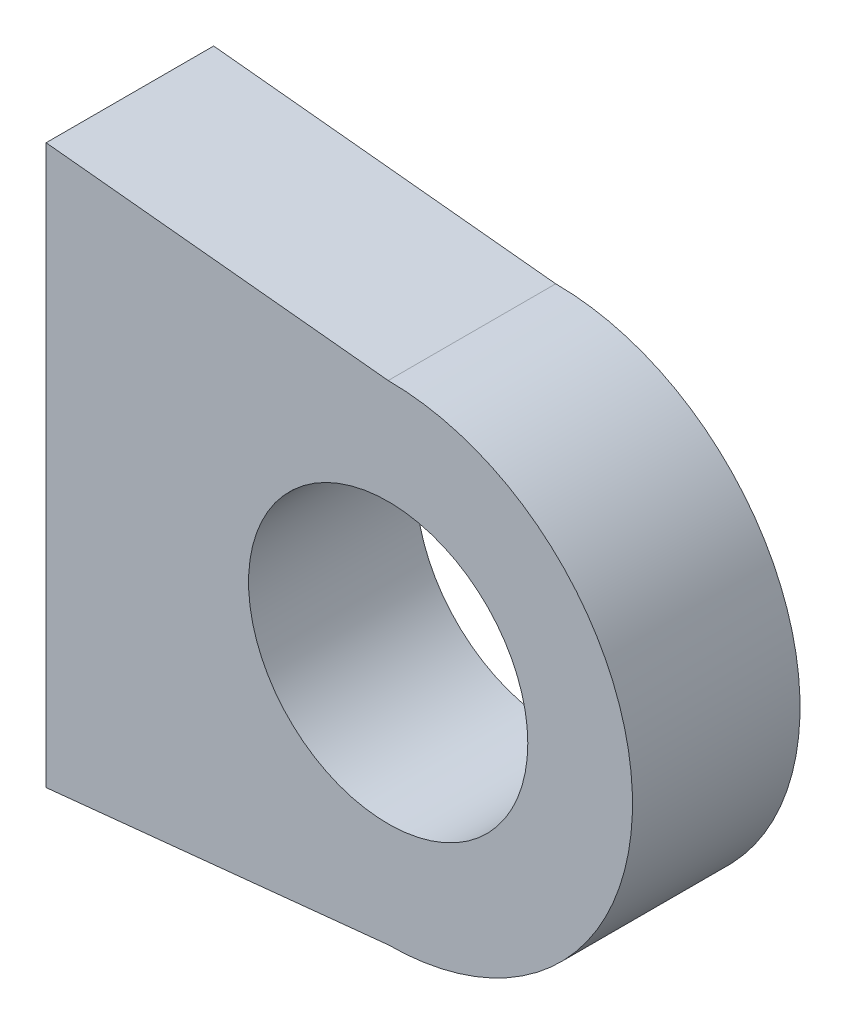
ISO-10303-21;
HEADER;
FILE_DESCRIPTION(('STEP AP214'),'2;1');
FILE_NAME('part.step','',(''),(''),'','','');
FILE_SCHEMA(('AUTOMOTIVE_DESIGN { 1 0 10303 214 1 1 1 1 }'));
ENDSEC;
DATA;
#1=APPLICATION_CONTEXT('core data for automotive mechanical design processes');
#2=APPLICATION_PROTOCOL_DEFINITION('international standard','automotive_design',2000,#1);
#3=PRODUCT_CONTEXT('',#1,'mechanical');
#4=PRODUCT('Part','Part','',(#3));
#5=PRODUCT_RELATED_PRODUCT_CATEGORY('part','',(#4));
#6=PRODUCT_DEFINITION_FORMATION('','',#4);
#7=PRODUCT_DEFINITION_CONTEXT('part definition',#1,'design');
#8=PRODUCT_DEFINITION('design','',#6,#7);
#9=PRODUCT_DEFINITION_SHAPE('','',#8);
#10=(LENGTH_UNIT() NAMED_UNIT(*) SI_UNIT(.MILLI.,.METRE.));
#11=(NAMED_UNIT(*) PLANE_ANGLE_UNIT() SI_UNIT($,.RADIAN.));
#12=(NAMED_UNIT(*) SI_UNIT($,.STERADIAN.) SOLID_ANGLE_UNIT());
#13=UNCERTAINTY_MEASURE_WITH_UNIT(LENGTH_MEASURE(1.E-05),#10,'distance_accuracy_value','');
#14=(GEOMETRIC_REPRESENTATION_CONTEXT(3) GLOBAL_UNCERTAINTY_ASSIGNED_CONTEXT((#13)) GLOBAL_UNIT_ASSIGNED_CONTEXT((#10,
#11,#12)) REPRESENTATION_CONTEXT('',''));
#15=CARTESIAN_POINT('',(0.,0.,0.));
#16=DIRECTION('',(0.,0.,1.));
#17=DIRECTION('',(1.,0.,0.));
#18=AXIS2_PLACEMENT_3D('',#15,#16,#17);
#19=CARTESIAN_POINT('',(12.25,0.,6.));
#20=DIRECTION('',(0.,0.,1.));
#21=DIRECTION('',(1.,0.,0.));
#22=AXIS2_PLACEMENT_3D('',#19,#20,#21);
#23=PLANE('',#22);
#24=DIRECTION('',(0.,-1.,0.));
#25=VECTOR('',#24,1.);
#26=CARTESIAN_POINT('',(0.,0.,6.));
#27=LINE('',#26,#25);
#28=CARTESIAN_POINT('',(0.,10.,6.));
#29=VERTEX_POINT('',#28);
#30=CARTESIAN_POINT('',(0.,-10.,6.));
#31=VERTEX_POINT('',#30);
#32=EDGE_CURVE('E57',#29,#31,#27,.T.);
#33=ORIENTED_EDGE('',*,*,#32,.T.);
#34=DIRECTION('',(0.994834142531266,0.101513688013394,0.));
#35=VECTOR('',#34,1.);
#36=CARTESIAN_POINT('',(0.,-10.,6.));
#37=LINE('',#36,#35);
#38=CARTESIAN_POINT('',(12.25,-8.75,6.));
#39=VERTEX_POINT('',#38);
#40=EDGE_CURVE('E88',#31,#39,#37,.T.);
#41=ORIENTED_EDGE('',*,*,#40,.T.);
#42=CARTESIAN_POINT('',(12.25,0.,6.));
#43=DIRECTION('',(0.,0.,1.));
#44=DIRECTION('',(1.,0.,0.));
#45=AXIS2_PLACEMENT_3D('',#42,#43,#44);
#46=CIRCLE('',#45,8.75);
#47=CARTESIAN_POINT('',(12.25,8.75,6.));
#48=VERTEX_POINT('',#47);
#49=EDGE_CURVE('E92',#39,#48,#46,.T.);
#50=ORIENTED_EDGE('',*,*,#49,.T.);
#51=DIRECTION('',(-0.994834142531266,0.101513688013394,0.));
#52=VECTOR('',#51,1.);
#53=CARTESIAN_POINT('',(0.,10.,6.));
#54=LINE('',#53,#52);
#55=EDGE_CURVE('E102',#48,#29,#54,.T.);
#56=ORIENTED_EDGE('',*,*,#55,.T.);
#57=EDGE_LOOP('',(#33,#41,#50,#56));
#58=FACE_BOUND('',#57,.T.);
#59=CARTESIAN_POINT('',(12.25,0.,6.));
#60=DIRECTION('',(0.,0.,1.));
#61=DIRECTION('',(1.,0.,0.));
#62=AXIS2_PLACEMENT_3D('',#59,#60,#61);
#63=CIRCLE('',#62,5.);
#64=CARTESIAN_POINT('',(17.25,0.,6.));
#65=VERTEX_POINT('',#64);
#66=EDGE_CURVE('E111',#65,#65,#63,.T.);
#67=ORIENTED_EDGE('',*,*,#66,.F.);
#68=EDGE_LOOP('',(#67));
#69=FACE_BOUND('',#68,.T.);
#70=ADVANCED_FACE('F39',(#58,#69),#23,.T.);
#71=CARTESIAN_POINT('',(12.25,0.,0.));
#72=DIRECTION('',(0.,0.,1.));
#73=DIRECTION('',(1.,0.,0.));
#74=AXIS2_PLACEMENT_3D('',#71,#72,#73);
#75=PLANE('',#74);
#76=DIRECTION('',(0.994834142531266,0.101513688013394,0.));
#77=VECTOR('',#76,1.);
#78=CARTESIAN_POINT('',(0.,-10.,0.));
#79=LINE('',#78,#77);
#80=CARTESIAN_POINT('',(0.,-10.,0.));
#81=VERTEX_POINT('',#80);
#82=CARTESIAN_POINT('',(12.25,-8.75,0.));
#83=VERTEX_POINT('',#82);
#84=EDGE_CURVE('E96',#81,#83,#79,.T.);
#85=ORIENTED_EDGE('',*,*,#84,.F.);
#86=DIRECTION('',(0.,-1.,0.));
#87=VECTOR('',#86,1.);
#88=CARTESIAN_POINT('',(0.,0.,0.));
#89=LINE('',#88,#87);
#90=CARTESIAN_POINT('',(0.,10.,0.));
#91=VERTEX_POINT('',#90);
#92=EDGE_CURVE('E116',#91,#81,#89,.T.);
#93=ORIENTED_EDGE('',*,*,#92,.F.);
#94=DIRECTION('',(-0.994834142531266,0.101513688013394,0.));
#95=VECTOR('',#94,1.);
#96=CARTESIAN_POINT('',(0.,10.,0.));
#97=LINE('',#96,#95);
#98=CARTESIAN_POINT('',(12.25,8.75,0.));
#99=VERTEX_POINT('',#98);
#100=EDGE_CURVE('E82',#99,#91,#97,.T.);
#101=ORIENTED_EDGE('',*,*,#100,.F.);
#102=CARTESIAN_POINT('',(12.25,0.,0.));
#103=DIRECTION('',(0.,0.,1.));
#104=DIRECTION('',(1.,0.,0.));
#105=AXIS2_PLACEMENT_3D('',#102,#103,#104);
#106=CIRCLE('',#105,8.75);
#107=EDGE_CURVE('E75',#83,#99,#106,.T.);
#108=ORIENTED_EDGE('',*,*,#107,.F.);
#109=EDGE_LOOP('',(#85,#93,#101,#108));
#110=FACE_BOUND('',#109,.T.);
#111=CARTESIAN_POINT('',(12.25,0.,0.));
#112=DIRECTION('',(0.,0.,1.));
#113=DIRECTION('',(1.,0.,0.));
#114=AXIS2_PLACEMENT_3D('',#111,#112,#113);
#115=CIRCLE('',#114,5.);
#116=CARTESIAN_POINT('',(17.25,0.,0.));
#117=VERTEX_POINT('',#116);
#118=EDGE_CURVE('E177',#117,#117,#115,.T.);
#119=ORIENTED_EDGE('',*,*,#118,.T.);
#120=EDGE_LOOP('',(#119));
#121=FACE_BOUND('',#120,.T.);
#122=ADVANCED_FACE('F125',(#110,#121),#75,.F.);
#123=CARTESIAN_POINT('',(0.,-10.,6.));
#124=DIRECTION('',(-0.101513688013394,0.994834142531266,0.));
#125=DIRECTION('',(-0.994834142531266,-0.101513688013394,0.));
#126=AXIS2_PLACEMENT_3D('',#123,#124,#125);
#127=PLANE('',#126);
#128=ORIENTED_EDGE('',*,*,#84,.T.);
#129=DIRECTION('',(0.,0.,-1.));
#130=VECTOR('',#129,1.);
#131=CARTESIAN_POINT('',(12.25,-8.75,6.));
#132=LINE('',#131,#130);
#133=EDGE_CURVE('E49',#39,#83,#132,.T.);
#134=ORIENTED_EDGE('',*,*,#133,.F.);
#135=ORIENTED_EDGE('',*,*,#40,.F.);
#136=DIRECTION('',(0.,0.,-1.));
#137=VECTOR('',#136,1.);
#138=CARTESIAN_POINT('',(0.,-10.,6.));
#139=LINE('',#138,#137);
#140=EDGE_CURVE('E11',#31,#81,#139,.T.);
#141=ORIENTED_EDGE('',*,*,#140,.T.);
#142=EDGE_LOOP('',(#128,#134,#135,#141));
#143=FACE_BOUND('',#142,.T.);
#144=ADVANCED_FACE('F41',(#143),#127,.F.);
#145=CARTESIAN_POINT('',(12.25,0.,6.));
#146=DIRECTION('',(0.,0.,-1.));
#147=DIRECTION('',(-1.,0.,0.));
#148=AXIS2_PLACEMENT_3D('',#145,#146,#147);
#149=CYLINDRICAL_SURFACE('',#148,8.75);
#150=ORIENTED_EDGE('',*,*,#107,.T.);
#151=DIRECTION('',(0.,0.,-1.));
#152=VECTOR('',#151,1.);
#153=CARTESIAN_POINT('',(12.25,8.75,6.));
#154=LINE('',#153,#152);
#155=EDGE_CURVE('E98',#48,#99,#154,.T.);
#156=ORIENTED_EDGE('',*,*,#155,.F.);
#157=ORIENTED_EDGE('',*,*,#49,.F.);
#158=ORIENTED_EDGE('',*,*,#133,.T.);
#159=EDGE_LOOP('',(#150,#156,#157,#158));
#160=FACE_BOUND('',#159,.T.);
#161=ADVANCED_FACE('F99',(#160),#149,.T.);
#162=CARTESIAN_POINT('',(0.,10.,6.));
#163=DIRECTION('',(-0.101513688013394,-0.994834142531266,0.));
#164=DIRECTION('',(0.994834142531266,-0.101513688013394,0.));
#165=AXIS2_PLACEMENT_3D('',#162,#163,#164);
#166=PLANE('',#165);
#167=ORIENTED_EDGE('',*,*,#100,.T.);
#168=DIRECTION('',(0.,0.,-1.));
#169=VECTOR('',#168,1.);
#170=CARTESIAN_POINT('',(0.,10.,6.));
#171=LINE('',#170,#169);
#172=EDGE_CURVE('E105',#29,#91,#171,.T.);
#173=ORIENTED_EDGE('',*,*,#172,.F.);
#174=ORIENTED_EDGE('',*,*,#55,.F.);
#175=ORIENTED_EDGE('',*,*,#155,.T.);
#176=EDGE_LOOP('',(#167,#173,#174,#175));
#177=FACE_BOUND('',#176,.T.);
#178=ADVANCED_FACE('F122',(#177),#166,.F.);
#179=CARTESIAN_POINT('',(0.,0.,6.));
#180=DIRECTION('',(1.,0.,0.));
#181=DIRECTION('',(0.,0.,-1.));
#182=AXIS2_PLACEMENT_3D('',#179,#180,#181);
#183=PLANE('',#182);
#184=CARTESIAN_POINT('',(0.,7.1,3.));
#185=DIRECTION('',(-1.,0.,0.));
#186=DIRECTION('',(0.,0.,1.));
#187=AXIS2_PLACEMENT_3D('',#184,#185,#186);
#188=CIRCLE('',#187,1.35);
#189=CARTESIAN_POINT('',(0.,7.1,4.35));
#190=VERTEX_POINT('',#189);
#191=EDGE_CURVE('E178',#190,#190,#188,.T.);
#192=ORIENTED_EDGE('',*,*,#191,.F.);
#193=EDGE_LOOP('',(#192));
#194=FACE_BOUND('',#193,.T.);
#195=CARTESIAN_POINT('',(0.,-7.1,3.));
#196=DIRECTION('',(-1.,0.,0.));
#197=DIRECTION('',(0.,0.,1.));
#198=AXIS2_PLACEMENT_3D('',#195,#196,#197);
#199=CIRCLE('',#198,1.35);
#200=CARTESIAN_POINT('',(0.,-7.1,4.35));
#201=VERTEX_POINT('',#200);
#202=EDGE_CURVE('E191',#201,#201,#199,.T.);
#203=ORIENTED_EDGE('',*,*,#202,.F.);
#204=EDGE_LOOP('',(#203));
#205=FACE_BOUND('',#204,.T.);
#206=CARTESIAN_POINT('',(0.,0.,3.));
#207=DIRECTION('',(-1.,0.,0.));
#208=DIRECTION('',(0.,0.,1.));
#209=AXIS2_PLACEMENT_3D('',#206,#207,#208);
#210=CIRCLE('',#209,2.);
#211=CARTESIAN_POINT('',(0.,0.,5.));
#212=VERTEX_POINT('',#211);
#213=EDGE_CURVE('E199',#212,#212,#210,.T.);
#214=ORIENTED_EDGE('',*,*,#213,.F.);
#215=EDGE_LOOP('',(#214));
#216=FACE_BOUND('',#215,.T.);
#217=ORIENTED_EDGE('',*,*,#92,.T.);
#218=ORIENTED_EDGE('',*,*,#140,.F.);
#219=ORIENTED_EDGE('',*,*,#32,.F.);
#220=ORIENTED_EDGE('',*,*,#172,.T.);
#221=EDGE_LOOP('',(#217,#218,#219,#220));
#222=FACE_BOUND('',#221,.T.);
#223=ADVANCED_FACE('F127',(#194,#205,#216,#222),#183,.F.);
#224=CARTESIAN_POINT('',(12.25,0.,6.));
#225=DIRECTION('',(0.,0.,-1.));
#226=DIRECTION('',(-1.,0.,0.));
#227=AXIS2_PLACEMENT_3D('',#224,#225,#226);
#228=CYLINDRICAL_SURFACE('',#227,5.);
#229=ORIENTED_EDGE('',*,*,#66,.T.);
#230=EDGE_LOOP('',(#229));
#231=FACE_BOUND('',#230,.T.);
#232=ORIENTED_EDGE('',*,*,#118,.F.);
#233=EDGE_LOOP('',(#232));
#234=FACE_BOUND('',#233,.T.);
#235=ADVANCED_FACE('F129',(#231,#234),#228,.F.);
#236=CARTESIAN_POINT('',(3.,0.,3.));
#237=DIRECTION('',(-1.,0.,0.));
#238=DIRECTION('',(0.,0.,1.));
#239=AXIS2_PLACEMENT_3D('',#236,#237,#238);
#240=CYLINDRICAL_SURFACE('',#239,2.);
#241=CARTESIAN_POINT('',(3.,0.,3.));
#242=DIRECTION('',(-1.,0.,0.));
#243=DIRECTION('',(0.,0.,1.));
#244=AXIS2_PLACEMENT_3D('',#241,#242,#243);
#245=CIRCLE('',#244,2.);
#246=CARTESIAN_POINT('',(3.,0.,5.));
#247=VERTEX_POINT('',#246);
#248=EDGE_CURVE('E195',#247,#247,#245,.T.);
#249=ORIENTED_EDGE('',*,*,#248,.F.);
#250=EDGE_LOOP('',(#249));
#251=FACE_BOUND('',#250,.T.);
#252=ORIENTED_EDGE('',*,*,#213,.T.);
#253=EDGE_LOOP('',(#252));
#254=FACE_BOUND('',#253,.T.);
#255=ADVANCED_FACE('F136',(#251,#254),#240,.F.);
#256=CARTESIAN_POINT('',(3.,0.,3.));
#257=DIRECTION('',(-1.,0.,0.));
#258=DIRECTION('',(0.,0.,1.));
#259=AXIS2_PLACEMENT_3D('',#256,#257,#258);
#260=PLANE('',#259);
#261=ORIENTED_EDGE('',*,*,#248,.T.);
#262=EDGE_LOOP('',(#261));
#263=FACE_BOUND('',#262,.T.);
#264=ADVANCED_FACE('F151',(#263),#260,.T.);
#265=CARTESIAN_POINT('',(3.,-7.1,3.));
#266=DIRECTION('',(-1.,0.,0.));
#267=DIRECTION('',(0.,0.,1.));
#268=AXIS2_PLACEMENT_3D('',#265,#266,#267);
#269=CYLINDRICAL_SURFACE('',#268,1.35);
#270=CARTESIAN_POINT('',(3.,-7.1,3.));
#271=DIRECTION('',(-1.,0.,0.));
#272=DIRECTION('',(0.,0.,1.));
#273=AXIS2_PLACEMENT_3D('',#270,#271,#272);
#274=CIRCLE('',#273,1.35);
#275=CARTESIAN_POINT('',(3.,-7.1,4.35));
#276=VERTEX_POINT('',#275);
#277=EDGE_CURVE('E185',#276,#276,#274,.T.);
#278=ORIENTED_EDGE('',*,*,#277,.F.);
#279=EDGE_LOOP('',(#278));
#280=FACE_BOUND('',#279,.T.);
#281=ORIENTED_EDGE('',*,*,#202,.T.);
#282=EDGE_LOOP('',(#281));
#283=FACE_BOUND('',#282,.T.);
#284=ADVANCED_FACE('F155',(#280,#283),#269,.F.);
#285=CARTESIAN_POINT('',(3.,-7.1,3.));
#286=DIRECTION('',(-1.,0.,0.));
#287=DIRECTION('',(0.,0.,1.));
#288=AXIS2_PLACEMENT_3D('',#285,#286,#287);
#289=PLANE('',#288);
#290=ORIENTED_EDGE('',*,*,#277,.T.);
#291=EDGE_LOOP('',(#290));
#292=FACE_BOUND('',#291,.T.);
#293=ADVANCED_FACE('F159',(#292),#289,.T.);
#294=CARTESIAN_POINT('',(3.,7.1,3.));
#295=DIRECTION('',(-1.,0.,0.));
#296=DIRECTION('',(0.,0.,1.));
#297=AXIS2_PLACEMENT_3D('',#294,#295,#296);
#298=CYLINDRICAL_SURFACE('',#297,1.35);
#299=CARTESIAN_POINT('',(3.,7.1,3.));
#300=DIRECTION('',(-1.,0.,0.));
#301=DIRECTION('',(0.,0.,1.));
#302=AXIS2_PLACEMENT_3D('',#299,#300,#301);
#303=CIRCLE('',#302,1.35);
#304=CARTESIAN_POINT('',(3.,7.1,4.35));
#305=VERTEX_POINT('',#304);
#306=EDGE_CURVE('E175',#305,#305,#303,.T.);
#307=ORIENTED_EDGE('',*,*,#306,.F.);
#308=EDGE_LOOP('',(#307));
#309=FACE_BOUND('',#308,.T.);
#310=ORIENTED_EDGE('',*,*,#191,.T.);
#311=EDGE_LOOP('',(#310));
#312=FACE_BOUND('',#311,.T.);
#313=ADVANCED_FACE('F163',(#309,#312),#298,.F.);
#314=CARTESIAN_POINT('',(3.,7.1,3.));
#315=DIRECTION('',(-1.,0.,0.));
#316=DIRECTION('',(0.,0.,1.));
#317=AXIS2_PLACEMENT_3D('',#314,#315,#316);
#318=PLANE('',#317);
#319=ORIENTED_EDGE('',*,*,#306,.T.);
#320=EDGE_LOOP('',(#319));
#321=FACE_BOUND('',#320,.T.);
#322=ADVANCED_FACE('F167',(#321),#318,.T.);
#323=CLOSED_SHELL('',(#70,#122,#144,#161,#178,#223,#235,#255,#264,#284,#293,#313,#322));
#324=MANIFOLD_SOLID_BREP('B2',#323);
#325=ADVANCED_BREP_SHAPE_REPRESENTATION('',(#18,#324),#14);
#326=SHAPE_DEFINITION_REPRESENTATION(#9,#325);
ENDSEC;
END-ISO-10303-21;
